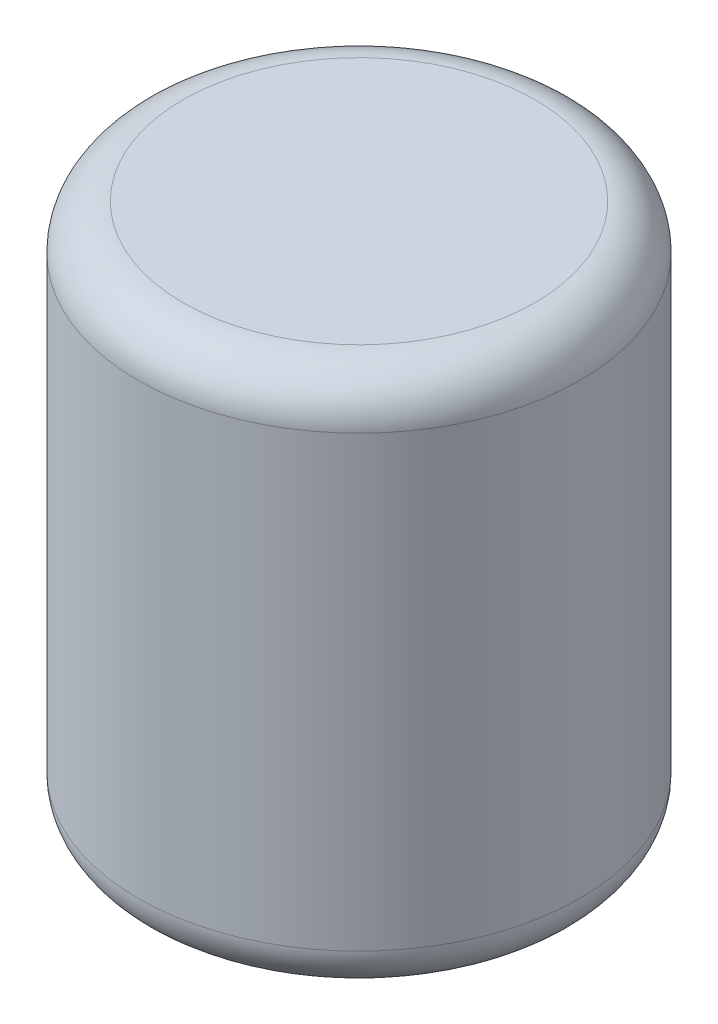
ISO-10303-21;
HEADER;
FILE_DESCRIPTION(('STEP AP214'),'2;1');
FILE_NAME('part.step','',(''),(''),'','','');
FILE_SCHEMA(('AUTOMOTIVE_DESIGN { 1 0 10303 214 1 1 1 1 }'));
ENDSEC;
DATA;
#1=APPLICATION_CONTEXT('core data for automotive mechanical design processes');
#2=APPLICATION_PROTOCOL_DEFINITION('international standard','automotive_design',2000,#1);
#3=PRODUCT_CONTEXT('',#1,'mechanical');
#4=PRODUCT('Part','Part','',(#3));
#5=PRODUCT_RELATED_PRODUCT_CATEGORY('part','',(#4));
#6=PRODUCT_DEFINITION_FORMATION('','',#4);
#7=PRODUCT_DEFINITION_CONTEXT('part definition',#1,'design');
#8=PRODUCT_DEFINITION('design','',#6,#7);
#9=PRODUCT_DEFINITION_SHAPE('','',#8);
#10=(LENGTH_UNIT() NAMED_UNIT(*) SI_UNIT(.MILLI.,.METRE.));
#11=(NAMED_UNIT(*) PLANE_ANGLE_UNIT() SI_UNIT($,.RADIAN.));
#12=(NAMED_UNIT(*) SI_UNIT($,.STERADIAN.) SOLID_ANGLE_UNIT());
#13=UNCERTAINTY_MEASURE_WITH_UNIT(LENGTH_MEASURE(1.E-05),#10,'distance_accuracy_value','');
#14=(GEOMETRIC_REPRESENTATION_CONTEXT(3) GLOBAL_UNCERTAINTY_ASSIGNED_CONTEXT((#13)) GLOBAL_UNIT_ASSIGNED_CONTEXT((#10,
#11,#12)) REPRESENTATION_CONTEXT('',''));
#15=CARTESIAN_POINT('',(0.,0.,0.));
#16=DIRECTION('',(0.,0.,1.));
#17=DIRECTION('',(1.,0.,0.));
#18=AXIS2_PLACEMENT_3D('',#15,#16,#17);
#19=CARTESIAN_POINT('',(0.,0.,0.));
#20=DIRECTION('',(0.,1.,0.));
#21=DIRECTION('',(0.,0.,1.));
#22=AXIS2_PLACEMENT_3D('',#19,#20,#21);
#23=CYLINDRICAL_SURFACE('',#22,1.4605);
#24=CARTESIAN_POINT('',(0.,0.5,0.));
#25=DIRECTION('',(0.,-1.,0.));
#26=DIRECTION('',(0.,0.,-1.));
#27=AXIS2_PLACEMENT_3D('',#24,#25,#26);
#28=CIRCLE('',#27,1.4605);
#29=CARTESIAN_POINT('',(0.,0.5,-1.4605));
#30=VERTEX_POINT('',#29);
#31=EDGE_CURVE('E10',#30,#30,#28,.T.);
#32=ORIENTED_EDGE('',*,*,#31,.T.);
#33=EDGE_LOOP('',(#32));
#34=FACE_BOUND('',#33,.T.);
#35=CARTESIAN_POINT('',(0.,4.,0.));
#36=DIRECTION('',(0.,1.,0.));
#37=DIRECTION('',(0.,0.,1.));
#38=AXIS2_PLACEMENT_3D('',#35,#36,#37);
#39=CIRCLE('',#38,1.4605);
#40=CARTESIAN_POINT('',(0.,4.,1.4605));
#41=VERTEX_POINT('',#40);
#42=EDGE_CURVE('E51',#41,#41,#39,.T.);
#43=ORIENTED_EDGE('',*,*,#42,.T.);
#44=EDGE_LOOP('',(#43));
#45=FACE_BOUND('',#44,.T.);
#46=ADVANCED_FACE('F31',(#34,#45),#23,.F.);
#47=CARTESIAN_POINT('',(-1.4605,4.,0.));
#48=DIRECTION('',(0.,-1.,0.));
#49=DIRECTION('',(0.,0.,-1.));
#50=AXIS2_PLACEMENT_3D('',#47,#48,#49);
#51=PLANE('',#50);
#52=ORIENTED_EDGE('',*,*,#42,.F.);
#53=EDGE_LOOP('',(#52));
#54=FACE_BOUND('',#53,.T.);
#55=ADVANCED_FACE('F72',(#54),#51,.T.);
#56=CARTESIAN_POINT('',(0.,6.,0.));
#57=DIRECTION('',(0.,1.,0.));
#58=DIRECTION('',(0.,0.,1.));
#59=AXIS2_PLACEMENT_3D('',#56,#57,#58);
#60=PLANE('',#59);
#61=CARTESIAN_POINT('',(0.,6.,0.));
#62=DIRECTION('',(0.,1.,0.));
#63=DIRECTION('',(0.,0.,1.));
#64=AXIS2_PLACEMENT_3D('',#61,#62,#63);
#65=CIRCLE('',#64,1.9605);
#66=CARTESIAN_POINT('',(0.,6.,1.9605));
#67=VERTEX_POINT('',#66);
#68=EDGE_CURVE('E48',#67,#67,#65,.T.);
#69=ORIENTED_EDGE('',*,*,#68,.T.);
#70=EDGE_LOOP('',(#69));
#71=FACE_BOUND('',#70,.T.);
#72=ADVANCED_FACE('F77',(#71),#60,.T.);
#73=CARTESIAN_POINT('',(0.,0.,0.));
#74=DIRECTION('',(0.,1.,0.));
#75=DIRECTION('',(0.,0.,1.));
#76=AXIS2_PLACEMENT_3D('',#73,#74,#75);
#77=CYLINDRICAL_SURFACE('',#76,2.4605);
#78=CARTESIAN_POINT('',(0.,5.5,0.));
#79=DIRECTION('',(0.,1.,0.));
#80=DIRECTION('',(0.,0.,1.));
#81=AXIS2_PLACEMENT_3D('',#78,#79,#80);
#82=CIRCLE('',#81,2.4605);
#83=CARTESIAN_POINT('',(0.,5.5,2.4605));
#84=VERTEX_POINT('',#83);
#85=EDGE_CURVE('E39',#84,#84,#82,.F.);
#86=ORIENTED_EDGE('',*,*,#85,.T.);
#87=EDGE_LOOP('',(#86));
#88=FACE_BOUND('',#87,.T.);
#89=CARTESIAN_POINT('',(0.,0.5,0.));
#90=DIRECTION('',(0.,-1.,0.));
#91=DIRECTION('',(0.,0.,-1.));
#92=AXIS2_PLACEMENT_3D('',#89,#90,#91);
#93=CIRCLE('',#92,2.4605);
#94=CARTESIAN_POINT('',(0.,0.5,-2.4605));
#95=VERTEX_POINT('',#94);
#96=EDGE_CURVE('E43',#95,#95,#93,.F.);
#97=ORIENTED_EDGE('',*,*,#96,.T.);
#98=EDGE_LOOP('',(#97));
#99=FACE_BOUND('',#98,.T.);
#100=ADVANCED_FACE('F68',(#88,#99),#77,.T.);
#101=CARTESIAN_POINT('',(0.,5.5,0.));
#102=DIRECTION('',(0.,1.,0.));
#103=DIRECTION('',(0.,0.,1.));
#104=AXIS2_PLACEMENT_3D('',#101,#102,#103);
#105=TOROIDAL_SURFACE('',#104,1.9605,0.5);
#106=ORIENTED_EDGE('',*,*,#85,.F.);
#107=EDGE_LOOP('',(#106));
#108=FACE_BOUND('',#107,.T.);
#109=ORIENTED_EDGE('',*,*,#68,.F.);
#110=EDGE_LOOP('',(#109));
#111=FACE_BOUND('',#110,.T.);
#112=ADVANCED_FACE('F62',(#108,#111),#105,.T.);
#113=CARTESIAN_POINT('',(0.,0.5,0.));
#114=DIRECTION('',(0.,-1.,0.));
#115=DIRECTION('',(0.,0.,-1.));
#116=AXIS2_PLACEMENT_3D('',#113,#114,#115);
#117=TOROIDAL_SURFACE('',#116,1.9605,0.5);
#118=ORIENTED_EDGE('',*,*,#31,.F.);
#119=EDGE_LOOP('',(#118));
#120=FACE_BOUND('',#119,.T.);
#121=CARTESIAN_POINT('',(0.,0.,0.));
#122=DIRECTION('',(0.,-1.,0.));
#123=DIRECTION('',(0.,0.,-1.));
#124=AXIS2_PLACEMENT_3D('',#121,#122,#123);
#125=CIRCLE('',#124,1.9605);
#126=CARTESIAN_POINT('',(0.,0.,-1.9605));
#127=VERTEX_POINT('',#126);
#128=EDGE_CURVE('E35',#127,#127,#125,.F.);
#129=ORIENTED_EDGE('',*,*,#128,.F.);
#130=EDGE_LOOP('',(#129));
#131=FACE_BOUND('',#130,.T.);
#132=ADVANCED_FACE('F33',(#120,#131),#117,.T.);
#133=CARTESIAN_POINT('',(0.,0.5,0.));
#134=DIRECTION('',(0.,-1.,0.));
#135=DIRECTION('',(0.,0.,-1.));
#136=AXIS2_PLACEMENT_3D('',#133,#134,#135);
#137=TOROIDAL_SURFACE('',#136,1.9605,0.5);
#138=ORIENTED_EDGE('',*,*,#128,.T.);
#139=EDGE_LOOP('',(#138));
#140=FACE_BOUND('',#139,.T.);
#141=ORIENTED_EDGE('',*,*,#96,.F.);
#142=EDGE_LOOP('',(#141));
#143=FACE_BOUND('',#142,.T.);
#144=ADVANCED_FACE('F58',(#140,#143),#137,.T.);
#145=CLOSED_SHELL('',(#46,#55,#72,#100,#112,#132,#144));
#146=MANIFOLD_SOLID_BREP('B2',#145);
#147=ADVANCED_BREP_SHAPE_REPRESENTATION('',(#18,#146),#14);
#148=SHAPE_DEFINITION_REPRESENTATION(#9,#147);
ENDSEC;
END-ISO-10303-21;
